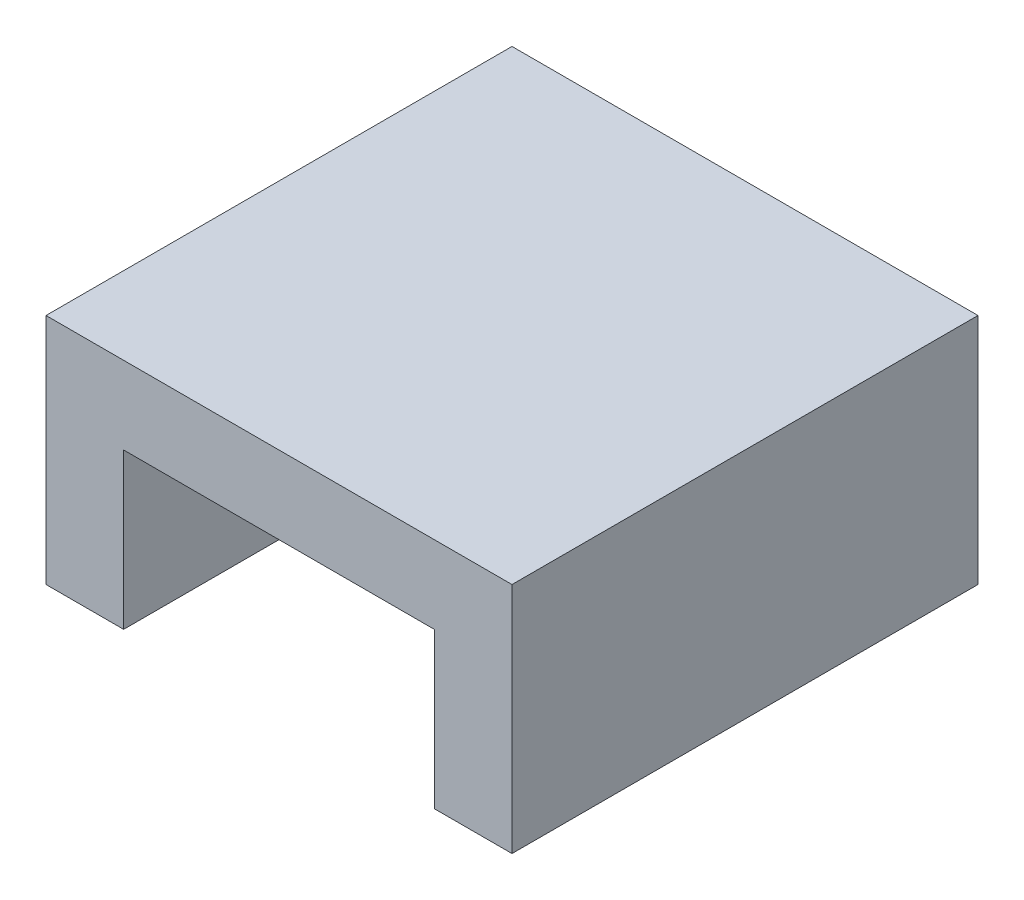
ISO-10303-21;
HEADER;
FILE_DESCRIPTION(('STEP AP214'),'2;1');
FILE_NAME('part.step','',(''),(''),'','','');
FILE_SCHEMA(('AUTOMOTIVE_DESIGN { 1 0 10303 214 1 1 1 1 }'));
ENDSEC;
DATA;
#1=APPLICATION_CONTEXT('core data for automotive mechanical design processes');
#2=APPLICATION_PROTOCOL_DEFINITION('international standard','automotive_design',2000,#1);
#3=PRODUCT_CONTEXT('',#1,'mechanical');
#4=PRODUCT('Part','Part','',(#3));
#5=PRODUCT_RELATED_PRODUCT_CATEGORY('part','',(#4));
#6=PRODUCT_DEFINITION_FORMATION('','',#4);
#7=PRODUCT_DEFINITION_CONTEXT('part definition',#1,'design');
#8=PRODUCT_DEFINITION('design','',#6,#7);
#9=PRODUCT_DEFINITION_SHAPE('','',#8);
#10=(LENGTH_UNIT() NAMED_UNIT(*) SI_UNIT(.MILLI.,.METRE.));
#11=(NAMED_UNIT(*) PLANE_ANGLE_UNIT() SI_UNIT($,.RADIAN.));
#12=(NAMED_UNIT(*) SI_UNIT($,.STERADIAN.) SOLID_ANGLE_UNIT());
#13=UNCERTAINTY_MEASURE_WITH_UNIT(LENGTH_MEASURE(1.E-05),#10,'distance_accuracy_value','');
#14=(GEOMETRIC_REPRESENTATION_CONTEXT(3) GLOBAL_UNCERTAINTY_ASSIGNED_CONTEXT((#13)) GLOBAL_UNIT_ASSIGNED_CONTEXT((#10,
#11,#12)) REPRESENTATION_CONTEXT('',''));
#15=CARTESIAN_POINT('',(0.,0.,0.));
#16=DIRECTION('',(0.,0.,1.));
#17=DIRECTION('',(1.,0.,0.));
#18=AXIS2_PLACEMENT_3D('',#15,#16,#17);
#19=CARTESIAN_POINT('',(-12.7,12.7,38.1));
#20=DIRECTION('',(0.,1.,0.));
#21=DIRECTION('',(0.,0.,1.));
#22=AXIS2_PLACEMENT_3D('',#19,#20,#21);
#23=PLANE('',#22);
#24=DIRECTION('',(1.,0.,0.));
#25=VECTOR('',#24,1.);
#26=CARTESIAN_POINT('',(-12.7,12.7,0.));
#27=LINE('',#26,#25);
#28=CARTESIAN_POINT('',(-12.7,12.7,0.));
#29=VERTEX_POINT('',#28);
#30=CARTESIAN_POINT('',(12.7,12.7,0.));
#31=VERTEX_POINT('',#30);
#32=EDGE_CURVE('E145',#29,#31,#27,.T.);
#33=ORIENTED_EDGE('',*,*,#32,.T.);
#34=DIRECTION('',(0.,0.,-1.));
#35=VECTOR('',#34,1.);
#36=CARTESIAN_POINT('',(12.7,12.7,38.1));
#37=LINE('',#36,#35);
#38=CARTESIAN_POINT('',(12.7,12.7,38.1));
#39=VERTEX_POINT('',#38);
#40=EDGE_CURVE('E11',#39,#31,#37,.T.);
#41=ORIENTED_EDGE('',*,*,#40,.F.);
#42=DIRECTION('',(1.,0.,0.));
#43=VECTOR('',#42,1.);
#44=CARTESIAN_POINT('',(-12.7,12.7,38.1));
#45=LINE('',#44,#43);
#46=CARTESIAN_POINT('',(-12.7,12.7,38.1));
#47=VERTEX_POINT('',#46);
#48=EDGE_CURVE('E167',#47,#39,#45,.T.);
#49=ORIENTED_EDGE('',*,*,#48,.F.);
#50=DIRECTION('',(0.,0.,-1.));
#51=VECTOR('',#50,1.);
#52=CARTESIAN_POINT('',(-12.7,12.7,38.1));
#53=LINE('',#52,#51);
#54=EDGE_CURVE('E141',#47,#29,#53,.T.);
#55=ORIENTED_EDGE('',*,*,#54,.T.);
#56=EDGE_LOOP('',(#33,#41,#49,#55));
#57=FACE_BOUND('',#56,.T.);
#58=ADVANCED_FACE('F44',(#57),#23,.F.);
#59=CARTESIAN_POINT('',(12.7,12.7,38.1));
#60=DIRECTION('',(1.,0.,0.));
#61=DIRECTION('',(0.,1.,0.));
#62=AXIS2_PLACEMENT_3D('',#59,#60,#61);
#63=PLANE('',#62);
#64=DIRECTION('',(0.,-1.,0.));
#65=VECTOR('',#64,1.);
#66=CARTESIAN_POINT('',(12.7,12.7,0.));
#67=LINE('',#66,#65);
#68=CARTESIAN_POINT('',(12.7,0.,0.));
#69=VERTEX_POINT('',#68);
#70=EDGE_CURVE('E149',#31,#69,#67,.T.);
#71=ORIENTED_EDGE('',*,*,#70,.T.);
#72=DIRECTION('',(0.,0.,-1.));
#73=VECTOR('',#72,1.);
#74=CARTESIAN_POINT('',(12.7,0.,38.1));
#75=LINE('',#74,#73);
#76=CARTESIAN_POINT('',(12.7,0.,38.1));
#77=VERTEX_POINT('',#76);
#78=EDGE_CURVE('E53',#77,#69,#75,.T.);
#79=ORIENTED_EDGE('',*,*,#78,.F.);
#80=DIRECTION('',(0.,-1.,0.));
#81=VECTOR('',#80,1.);
#82=CARTESIAN_POINT('',(12.7,12.7,38.1));
#83=LINE('',#82,#81);
#84=EDGE_CURVE('E104',#39,#77,#83,.T.);
#85=ORIENTED_EDGE('',*,*,#84,.F.);
#86=ORIENTED_EDGE('',*,*,#40,.T.);
#87=EDGE_LOOP('',(#71,#79,#85,#86));
#88=FACE_BOUND('',#87,.T.);
#89=ADVANCED_FACE('F213',(#88),#63,.F.);
#90=CARTESIAN_POINT('',(12.7,0.,38.1));
#91=DIRECTION('',(0.,1.,0.));
#92=DIRECTION('',(0.,0.,1.));
#93=AXIS2_PLACEMENT_3D('',#90,#91,#92);
#94=PLANE('',#93);
#95=DIRECTION('',(1.,0.,0.));
#96=VECTOR('',#95,1.);
#97=CARTESIAN_POINT('',(12.7,0.,0.));
#98=LINE('',#97,#96);
#99=CARTESIAN_POINT('',(19.05,0.,0.));
#100=VERTEX_POINT('',#99);
#101=EDGE_CURVE('E152',#69,#100,#98,.T.);
#102=ORIENTED_EDGE('',*,*,#101,.T.);
#103=DIRECTION('',(0.,0.,-1.));
#104=VECTOR('',#103,1.);
#105=CARTESIAN_POINT('',(19.05,0.,38.1));
#106=LINE('',#105,#104);
#107=CARTESIAN_POINT('',(19.05,0.,38.1));
#108=VERTEX_POINT('',#107);
#109=EDGE_CURVE('E178',#108,#100,#106,.T.);
#110=ORIENTED_EDGE('',*,*,#109,.F.);
#111=DIRECTION('',(1.,0.,0.));
#112=VECTOR('',#111,1.);
#113=CARTESIAN_POINT('',(12.7,0.,38.1));
#114=LINE('',#113,#112);
#115=EDGE_CURVE('E188',#77,#108,#114,.T.);
#116=ORIENTED_EDGE('',*,*,#115,.F.);
#117=ORIENTED_EDGE('',*,*,#78,.T.);
#118=EDGE_LOOP('',(#102,#110,#116,#117));
#119=FACE_BOUND('',#118,.T.);
#120=ADVANCED_FACE('F186',(#119),#94,.F.);
#121=CARTESIAN_POINT('',(19.05,19.05,38.1));
#122=DIRECTION('',(-1.,0.,0.));
#123=DIRECTION('',(0.,0.,1.));
#124=AXIS2_PLACEMENT_3D('',#121,#122,#123);
#125=PLANE('',#124);
#126=DIRECTION('',(0.,1.,0.));
#127=VECTOR('',#126,1.);
#128=CARTESIAN_POINT('',(19.05,19.05,0.));
#129=LINE('',#128,#127);
#130=CARTESIAN_POINT('',(19.05,19.05,0.));
#131=VERTEX_POINT('',#130);
#132=EDGE_CURVE('E155',#100,#131,#129,.T.);
#133=ORIENTED_EDGE('',*,*,#132,.T.);
#134=DIRECTION('',(0.,0.,-1.));
#135=VECTOR('',#134,1.);
#136=CARTESIAN_POINT('',(19.05,19.05,38.1));
#137=LINE('',#136,#135);
#138=CARTESIAN_POINT('',(19.05,19.05,38.1));
#139=VERTEX_POINT('',#138);
#140=EDGE_CURVE('E174',#139,#131,#137,.T.);
#141=ORIENTED_EDGE('',*,*,#140,.F.);
#142=DIRECTION('',(0.,1.,0.));
#143=VECTOR('',#142,1.);
#144=CARTESIAN_POINT('',(19.05,19.05,38.1));
#145=LINE('',#144,#143);
#146=EDGE_CURVE('E201',#108,#139,#145,.T.);
#147=ORIENTED_EDGE('',*,*,#146,.F.);
#148=ORIENTED_EDGE('',*,*,#109,.T.);
#149=EDGE_LOOP('',(#133,#141,#147,#148));
#150=FACE_BOUND('',#149,.T.);
#151=ADVANCED_FACE('F196',(#150),#125,.F.);
#152=CARTESIAN_POINT('',(-19.05,19.05,38.1));
#153=DIRECTION('',(0.,-1.,0.));
#154=DIRECTION('',(0.,0.,-1.));
#155=AXIS2_PLACEMENT_3D('',#152,#153,#154);
#156=PLANE('',#155);
#157=DIRECTION('',(-1.,0.,0.));
#158=VECTOR('',#157,1.);
#159=CARTESIAN_POINT('',(-19.05,19.05,0.));
#160=LINE('',#159,#158);
#161=CARTESIAN_POINT('',(-19.05,19.05,0.));
#162=VERTEX_POINT('',#161);
#163=EDGE_CURVE('E158',#131,#162,#160,.T.);
#164=ORIENTED_EDGE('',*,*,#163,.T.);
#165=DIRECTION('',(0.,0.,-1.));
#166=VECTOR('',#165,1.);
#167=CARTESIAN_POINT('',(-19.05,19.05,38.1));
#168=LINE('',#167,#166);
#169=CARTESIAN_POINT('',(-19.05,19.05,38.1));
#170=VERTEX_POINT('',#169);
#171=EDGE_CURVE('E134',#170,#162,#168,.T.);
#172=ORIENTED_EDGE('',*,*,#171,.F.);
#173=DIRECTION('',(-1.,0.,0.));
#174=VECTOR('',#173,1.);
#175=CARTESIAN_POINT('',(-19.05,19.05,38.1));
#176=LINE('',#175,#174);
#177=EDGE_CURVE('E123',#139,#170,#176,.T.);
#178=ORIENTED_EDGE('',*,*,#177,.F.);
#179=ORIENTED_EDGE('',*,*,#140,.T.);
#180=EDGE_LOOP('',(#164,#172,#178,#179));
#181=FACE_BOUND('',#180,.T.);
#182=ADVANCED_FACE('F199',(#181),#156,.F.);
#183=CARTESIAN_POINT('',(-19.05,0.,38.1));
#184=DIRECTION('',(1.,0.,0.));
#185=DIRECTION('',(0.,0.,-1.));
#186=AXIS2_PLACEMENT_3D('',#183,#184,#185);
#187=PLANE('',#186);
#188=DIRECTION('',(0.,-1.,0.));
#189=VECTOR('',#188,1.);
#190=CARTESIAN_POINT('',(-19.05,0.,0.));
#191=LINE('',#190,#189);
#192=CARTESIAN_POINT('',(-19.05,0.,0.));
#193=VERTEX_POINT('',#192);
#194=EDGE_CURVE('E132',#162,#193,#191,.T.);
#195=ORIENTED_EDGE('',*,*,#194,.T.);
#196=DIRECTION('',(0.,0.,-1.));
#197=VECTOR('',#196,1.);
#198=CARTESIAN_POINT('',(-19.05,0.,38.1));
#199=LINE('',#198,#197);
#200=CARTESIAN_POINT('',(-19.05,0.,38.1));
#201=VERTEX_POINT('',#200);
#202=EDGE_CURVE('E129',#201,#193,#199,.T.);
#203=ORIENTED_EDGE('',*,*,#202,.F.);
#204=DIRECTION('',(0.,-1.,0.));
#205=VECTOR('',#204,1.);
#206=CARTESIAN_POINT('',(-19.05,0.,38.1));
#207=LINE('',#206,#205);
#208=EDGE_CURVE('E117',#170,#201,#207,.T.);
#209=ORIENTED_EDGE('',*,*,#208,.F.);
#210=ORIENTED_EDGE('',*,*,#171,.T.);
#211=EDGE_LOOP('',(#195,#203,#209,#210));
#212=FACE_BOUND('',#211,.T.);
#213=ADVANCED_FACE('F130',(#212),#187,.F.);
#214=CARTESIAN_POINT('',(-19.05,0.,38.1));
#215=DIRECTION('',(0.,1.,0.));
#216=DIRECTION('',(0.,0.,1.));
#217=AXIS2_PLACEMENT_3D('',#214,#215,#216);
#218=PLANE('',#217);
#219=DIRECTION('',(1.,0.,0.));
#220=VECTOR('',#219,1.);
#221=CARTESIAN_POINT('',(-19.05,0.,0.));
#222=LINE('',#221,#220);
#223=CARTESIAN_POINT('',(-12.7,0.,0.));
#224=VERTEX_POINT('',#223);
#225=EDGE_CURVE('E90',#193,#224,#222,.T.);
#226=ORIENTED_EDGE('',*,*,#225,.T.);
#227=DIRECTION('',(0.,0.,-1.));
#228=VECTOR('',#227,1.);
#229=CARTESIAN_POINT('',(-12.7,0.,38.1));
#230=LINE('',#229,#228);
#231=CARTESIAN_POINT('',(-12.7,0.,38.1));
#232=VERTEX_POINT('',#231);
#233=EDGE_CURVE('E135',#232,#224,#230,.T.);
#234=ORIENTED_EDGE('',*,*,#233,.F.);
#235=DIRECTION('',(1.,0.,0.));
#236=VECTOR('',#235,1.);
#237=CARTESIAN_POINT('',(-19.05,0.,38.1));
#238=LINE('',#237,#236);
#239=EDGE_CURVE('E121',#201,#232,#238,.T.);
#240=ORIENTED_EDGE('',*,*,#239,.F.);
#241=ORIENTED_EDGE('',*,*,#202,.T.);
#242=EDGE_LOOP('',(#226,#234,#240,#241));
#243=FACE_BOUND('',#242,.T.);
#244=ADVANCED_FACE('F137',(#243),#218,.F.);
#245=CARTESIAN_POINT('',(-12.7,0.,38.1));
#246=DIRECTION('',(-1.,0.,0.));
#247=DIRECTION('',(0.,-1.,0.));
#248=AXIS2_PLACEMENT_3D('',#245,#246,#247);
#249=PLANE('',#248);
#250=DIRECTION('',(0.,1.,0.));
#251=VECTOR('',#250,1.);
#252=CARTESIAN_POINT('',(-12.7,0.,0.));
#253=LINE('',#252,#251);
#254=EDGE_CURVE('E96',#224,#29,#253,.T.);
#255=ORIENTED_EDGE('',*,*,#254,.T.);
#256=ORIENTED_EDGE('',*,*,#54,.F.);
#257=DIRECTION('',(0.,1.,0.));
#258=VECTOR('',#257,1.);
#259=CARTESIAN_POINT('',(-12.7,0.,38.1));
#260=LINE('',#259,#258);
#261=EDGE_CURVE('E61',#232,#47,#260,.T.);
#262=ORIENTED_EDGE('',*,*,#261,.F.);
#263=ORIENTED_EDGE('',*,*,#233,.T.);
#264=EDGE_LOOP('',(#255,#256,#262,#263));
#265=FACE_BOUND('',#264,.T.);
#266=ADVANCED_FACE('F229',(#265),#249,.F.);
#267=CARTESIAN_POINT('',(0.,0.,38.1));
#268=DIRECTION('',(0.,0.,-1.));
#269=DIRECTION('',(-1.,0.,0.));
#270=AXIS2_PLACEMENT_3D('',#267,#268,#269);
#271=PLANE('',#270);
#272=ORIENTED_EDGE('',*,*,#48,.T.);
#273=ORIENTED_EDGE('',*,*,#84,.T.);
#274=ORIENTED_EDGE('',*,*,#115,.T.);
#275=ORIENTED_EDGE('',*,*,#146,.T.);
#276=ORIENTED_EDGE('',*,*,#177,.T.);
#277=ORIENTED_EDGE('',*,*,#208,.T.);
#278=ORIENTED_EDGE('',*,*,#239,.T.);
#279=ORIENTED_EDGE('',*,*,#261,.T.);
#280=EDGE_LOOP('',(#272,#273,#274,#275,#276,#277,#278,#279));
#281=FACE_BOUND('',#280,.T.);
#282=ADVANCED_FACE('F119',(#281),#271,.F.);
#283=CARTESIAN_POINT('',(0.,0.,0.));
#284=DIRECTION('',(0.,0.,-1.));
#285=DIRECTION('',(-1.,0.,0.));
#286=AXIS2_PLACEMENT_3D('',#283,#284,#285);
#287=PLANE('',#286);
#288=ORIENTED_EDGE('',*,*,#32,.F.);
#289=ORIENTED_EDGE('',*,*,#254,.F.);
#290=ORIENTED_EDGE('',*,*,#225,.F.);
#291=ORIENTED_EDGE('',*,*,#194,.F.);
#292=ORIENTED_EDGE('',*,*,#163,.F.);
#293=ORIENTED_EDGE('',*,*,#132,.F.);
#294=ORIENTED_EDGE('',*,*,#101,.F.);
#295=ORIENTED_EDGE('',*,*,#70,.F.);
#296=EDGE_LOOP('',(#288,#289,#290,#291,#292,#293,#294,#295));
#297=FACE_BOUND('',#296,.T.);
#298=ADVANCED_FACE('F192',(#297),#287,.T.);
#299=CLOSED_SHELL('',(#58,#89,#120,#151,#182,#213,#244,#266,#282,#298));
#300=MANIFOLD_SOLID_BREP('B2',#299);
#301=ADVANCED_BREP_SHAPE_REPRESENTATION('',(#18,#300),#14);
#302=SHAPE_DEFINITION_REPRESENTATION(#9,#301);
ENDSEC;
END-ISO-10303-21;
